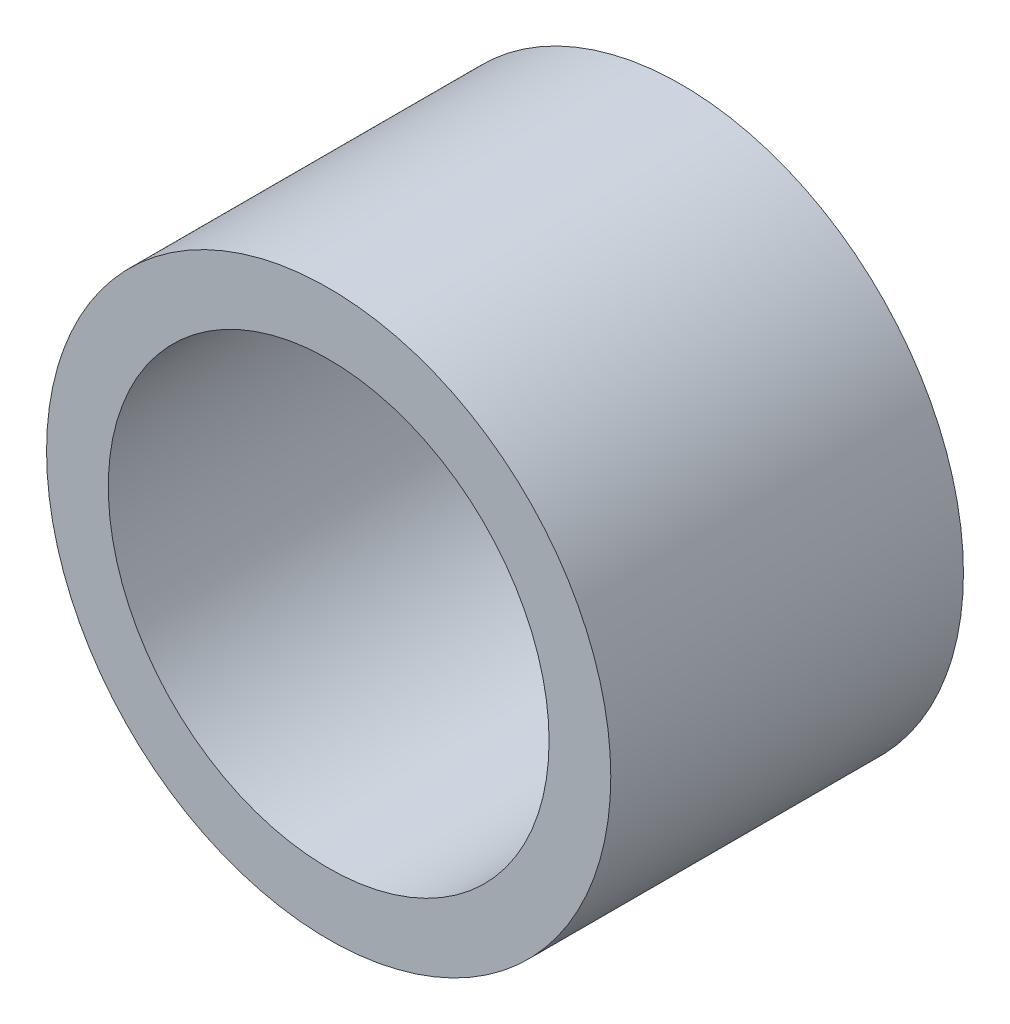
ISO-10303-21;
HEADER;
FILE_DESCRIPTION(('STEP AP214'),'2;1');
FILE_NAME('part.step','',(''),(''),'','','');
FILE_SCHEMA(('AUTOMOTIVE_DESIGN { 1 0 10303 214 1 1 1 1 }'));
ENDSEC;
DATA;
#1=APPLICATION_CONTEXT('core data for automotive mechanical design processes');
#2=APPLICATION_PROTOCOL_DEFINITION('international standard','automotive_design',2000,#1);
#3=PRODUCT_CONTEXT('',#1,'mechanical');
#4=PRODUCT('Part','Part','',(#3));
#5=PRODUCT_RELATED_PRODUCT_CATEGORY('part','',(#4));
#6=PRODUCT_DEFINITION_FORMATION('','',#4);
#7=PRODUCT_DEFINITION_CONTEXT('part definition',#1,'design');
#8=PRODUCT_DEFINITION('design','',#6,#7);
#9=PRODUCT_DEFINITION_SHAPE('','',#8);
#10=(LENGTH_UNIT() NAMED_UNIT(*) SI_UNIT(.MILLI.,.METRE.));
#11=(NAMED_UNIT(*) PLANE_ANGLE_UNIT() SI_UNIT($,.RADIAN.));
#12=(NAMED_UNIT(*) SI_UNIT($,.STERADIAN.) SOLID_ANGLE_UNIT());
#13=UNCERTAINTY_MEASURE_WITH_UNIT(LENGTH_MEASURE(1.E-05),#10,'distance_accuracy_value','');
#14=(GEOMETRIC_REPRESENTATION_CONTEXT(3) GLOBAL_UNCERTAINTY_ASSIGNED_CONTEXT((#13)) GLOBAL_UNIT_ASSIGNED_CONTEXT((#10,
#11,#12)) REPRESENTATION_CONTEXT('',''));
#15=CARTESIAN_POINT('',(0.,0.,0.));
#16=DIRECTION('',(0.,0.,1.));
#17=DIRECTION('',(1.,0.,0.));
#18=AXIS2_PLACEMENT_3D('',#15,#16,#17);
#19=CARTESIAN_POINT('',(0.,0.,20.));
#20=DIRECTION('',(0.,0.,-1.));
#21=DIRECTION('',(-1.,0.,0.));
#22=AXIS2_PLACEMENT_3D('',#19,#20,#21);
#23=CYLINDRICAL_SURFACE('',#22,16.);
#24=CARTESIAN_POINT('',(0.,0.,20.));
#25=DIRECTION('',(0.,0.,1.));
#26=DIRECTION('',(1.,0.,0.));
#27=AXIS2_PLACEMENT_3D('',#24,#25,#26);
#28=CIRCLE('',#27,16.);
#29=CARTESIAN_POINT('',(16.,0.,20.));
#30=VERTEX_POINT('',#29);
#31=EDGE_CURVE('E10',#30,#30,#28,.T.);
#32=ORIENTED_EDGE('',*,*,#31,.F.);
#33=EDGE_LOOP('',(#32));
#34=FACE_BOUND('',#33,.T.);
#35=CARTESIAN_POINT('',(0.,0.,0.));
#36=DIRECTION('',(0.,0.,1.));
#37=DIRECTION('',(1.,0.,0.));
#38=AXIS2_PLACEMENT_3D('',#35,#36,#37);
#39=CIRCLE('',#38,16.);
#40=CARTESIAN_POINT('',(16.,0.,0.));
#41=VERTEX_POINT('',#40);
#42=EDGE_CURVE('E33',#41,#41,#39,.T.);
#43=ORIENTED_EDGE('',*,*,#42,.T.);
#44=EDGE_LOOP('',(#43));
#45=FACE_BOUND('',#44,.T.);
#46=ADVANCED_FACE('F30',(#34,#45),#23,.T.);
#47=CARTESIAN_POINT('',(0.,0.,20.));
#48=DIRECTION('',(0.,0.,1.));
#49=DIRECTION('',(1.,0.,0.));
#50=AXIS2_PLACEMENT_3D('',#47,#48,#49);
#51=PLANE('',#50);
#52=CARTESIAN_POINT('',(0.,0.,20.));
#53=DIRECTION('',(0.,0.,1.));
#54=DIRECTION('',(1.,0.,0.));
#55=AXIS2_PLACEMENT_3D('',#52,#53,#54);
#56=CIRCLE('',#55,12.5);
#57=CARTESIAN_POINT('',(12.5,0.,20.));
#58=VERTEX_POINT('',#57);
#59=EDGE_CURVE('E42',#58,#58,#56,.T.);
#60=ORIENTED_EDGE('',*,*,#59,.F.);
#61=EDGE_LOOP('',(#60));
#62=FACE_BOUND('',#61,.T.);
#63=ORIENTED_EDGE('',*,*,#31,.T.);
#64=EDGE_LOOP('',(#63));
#65=FACE_BOUND('',#64,.T.);
#66=ADVANCED_FACE('F57',(#62,#65),#51,.T.);
#67=CARTESIAN_POINT('',(0.,0.,0.));
#68=DIRECTION('',(0.,0.,1.));
#69=DIRECTION('',(1.,0.,0.));
#70=AXIS2_PLACEMENT_3D('',#67,#68,#69);
#71=PLANE('',#70);
#72=CARTESIAN_POINT('',(0.,0.,0.));
#73=DIRECTION('',(0.,0.,1.));
#74=DIRECTION('',(1.,0.,0.));
#75=AXIS2_PLACEMENT_3D('',#72,#73,#74);
#76=CIRCLE('',#75,12.5);
#77=CARTESIAN_POINT('',(12.5,0.,0.));
#78=VERTEX_POINT('',#77);
#79=EDGE_CURVE('E40',#78,#78,#76,.T.);
#80=ORIENTED_EDGE('',*,*,#79,.T.);
#81=EDGE_LOOP('',(#80));
#82=FACE_BOUND('',#81,.T.);
#83=ORIENTED_EDGE('',*,*,#42,.F.);
#84=EDGE_LOOP('',(#83));
#85=FACE_BOUND('',#84,.T.);
#86=ADVANCED_FACE('F48',(#82,#85),#71,.F.);
#87=CARTESIAN_POINT('',(0.,0.,0.));
#88=DIRECTION('',(0.,0.,1.));
#89=DIRECTION('',(1.,0.,0.));
#90=AXIS2_PLACEMENT_3D('',#87,#88,#89);
#91=CYLINDRICAL_SURFACE('',#90,12.5);
#92=ORIENTED_EDGE('',*,*,#79,.F.);
#93=EDGE_LOOP('',(#92));
#94=FACE_BOUND('',#93,.T.);
#95=ORIENTED_EDGE('',*,*,#59,.T.);
#96=EDGE_LOOP('',(#95));
#97=FACE_BOUND('',#96,.T.);
#98=ADVANCED_FACE('F51',(#94,#97),#91,.F.);
#99=CLOSED_SHELL('',(#46,#66,#86,#98));
#100=MANIFOLD_SOLID_BREP('B2',#99);
#101=ADVANCED_BREP_SHAPE_REPRESENTATION('',(#18,#100),#14);
#102=SHAPE_DEFINITION_REPRESENTATION(#9,#101);
ENDSEC;
END-ISO-10303-21;
